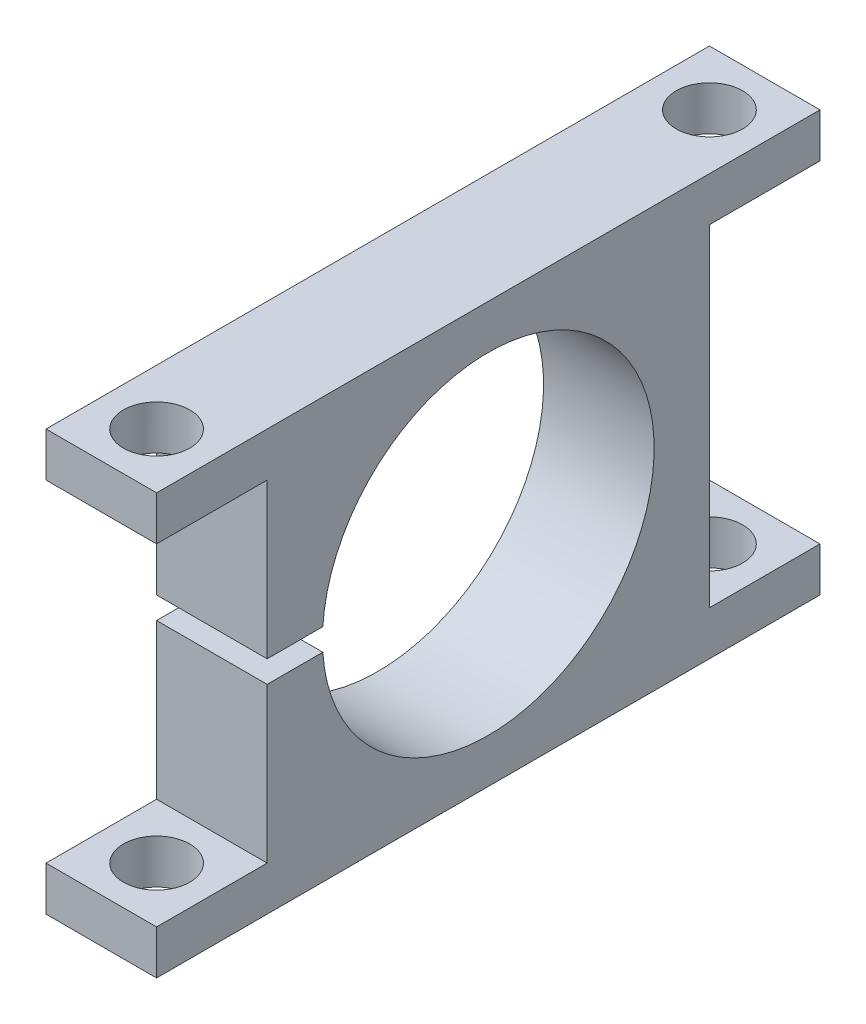
ISO-10303-21;
HEADER;
FILE_DESCRIPTION(('STEP AP214'),'2;1');
FILE_NAME('part.step','',(''),(''),'','','');
FILE_SCHEMA(('AUTOMOTIVE_DESIGN { 1 0 10303 214 1 1 1 1 }'));
ENDSEC;
DATA;
#1=APPLICATION_CONTEXT('core data for automotive mechanical design processes');
#2=APPLICATION_PROTOCOL_DEFINITION('international standard','automotive_design',2000,#1);
#3=PRODUCT_CONTEXT('',#1,'mechanical');
#4=PRODUCT('Part','Part','',(#3));
#5=PRODUCT_RELATED_PRODUCT_CATEGORY('part','',(#4));
#6=PRODUCT_DEFINITION_FORMATION('','',#4);
#7=PRODUCT_DEFINITION_CONTEXT('part definition',#1,'design');
#8=PRODUCT_DEFINITION('design','',#6,#7);
#9=PRODUCT_DEFINITION_SHAPE('','',#8);
#10=(LENGTH_UNIT() NAMED_UNIT(*) SI_UNIT(.MILLI.,.METRE.));
#11=(NAMED_UNIT(*) PLANE_ANGLE_UNIT() SI_UNIT($,.RADIAN.));
#12=(NAMED_UNIT(*) SI_UNIT($,.STERADIAN.) SOLID_ANGLE_UNIT());
#13=UNCERTAINTY_MEASURE_WITH_UNIT(LENGTH_MEASURE(1.E-05),#10,'distance_accuracy_value','');
#14=(GEOMETRIC_REPRESENTATION_CONTEXT(3) GLOBAL_UNCERTAINTY_ASSIGNED_CONTEXT((#13)) GLOBAL_UNIT_ASSIGNED_CONTEXT((#10,
#11,#12)) REPRESENTATION_CONTEXT('',''));
#15=CARTESIAN_POINT('',(0.,0.,0.));
#16=DIRECTION('',(0.,0.,1.));
#17=DIRECTION('',(1.,0.,0.));
#18=AXIS2_PLACEMENT_3D('',#15,#16,#17);
#19=CARTESIAN_POINT('',(5.,-9.5,10.));
#20=DIRECTION('',(0.,0.,-1.));
#21=DIRECTION('',(-1.,0.,0.));
#22=AXIS2_PLACEMENT_3D('',#19,#20,#21);
#23=PLANE('',#22);
#24=DIRECTION('',(0.,-1.,0.));
#25=VECTOR('',#24,1.);
#26=CARTESIAN_POINT('',(0.,-9.5,10.));
#27=LINE('',#26,#25);
#28=CARTESIAN_POINT('',(0.,7.5,10.));
#29=VERTEX_POINT('',#28);
#30=CARTESIAN_POINT('',(0.,0.5,10.));
#31=VERTEX_POINT('',#30);
#32=EDGE_CURVE('E224',#29,#31,#27,.T.);
#33=ORIENTED_EDGE('',*,*,#32,.T.);
#34=DIRECTION('',(1.,0.,0.));
#35=VECTOR('',#34,1.);
#36=CARTESIAN_POINT('',(5.,0.5,10.));
#37=LINE('',#36,#35);
#38=CARTESIAN_POINT('',(5.,0.5,10.));
#39=VERTEX_POINT('',#38);
#40=EDGE_CURVE('E385',#31,#39,#37,.T.);
#41=ORIENTED_EDGE('',*,*,#40,.T.);
#42=DIRECTION('',(0.,-1.,0.));
#43=VECTOR('',#42,1.);
#44=CARTESIAN_POINT('',(5.,-9.5,10.));
#45=LINE('',#44,#43);
#46=CARTESIAN_POINT('',(5.,7.5,10.));
#47=VERTEX_POINT('',#46);
#48=EDGE_CURVE('E203',#47,#39,#45,.T.);
#49=ORIENTED_EDGE('',*,*,#48,.F.);
#50=DIRECTION('',(-1.,0.,0.));
#51=VECTOR('',#50,1.);
#52=CARTESIAN_POINT('',(5.,7.5,10.));
#53=LINE('',#52,#51);
#54=EDGE_CURVE('E262',#47,#29,#53,.T.);
#55=ORIENTED_EDGE('',*,*,#54,.T.);
#56=EDGE_LOOP('',(#33,#41,#49,#55));
#57=FACE_BOUND('',#56,.T.);
#58=ADVANCED_FACE('F35',(#57),#23,.F.);
#59=CARTESIAN_POINT('',(5.,-9.5,-10.));
#60=DIRECTION('',(0.,0.,1.));
#61=DIRECTION('',(1.,0.,0.));
#62=AXIS2_PLACEMENT_3D('',#59,#60,#61);
#63=PLANE('',#62);
#64=DIRECTION('',(0.,1.,0.));
#65=VECTOR('',#64,1.);
#66=CARTESIAN_POINT('',(5.,-9.5,-10.));
#67=LINE('',#66,#65);
#68=CARTESIAN_POINT('',(5.,-7.5,-10.));
#69=VERTEX_POINT('',#68);
#70=CARTESIAN_POINT('',(5.,7.5,-10.));
#71=VERTEX_POINT('',#70);
#72=EDGE_CURVE('E216',#69,#71,#67,.T.);
#73=ORIENTED_EDGE('',*,*,#72,.F.);
#74=DIRECTION('',(-1.,0.,0.));
#75=VECTOR('',#74,1.);
#76=CARTESIAN_POINT('',(5.,-7.5,-10.));
#77=LINE('',#76,#75);
#78=CARTESIAN_POINT('',(0.,-7.5,-10.));
#79=VERTEX_POINT('',#78);
#80=EDGE_CURVE('E347',#69,#79,#77,.T.);
#81=ORIENTED_EDGE('',*,*,#80,.T.);
#82=DIRECTION('',(0.,1.,0.));
#83=VECTOR('',#82,1.);
#84=CARTESIAN_POINT('',(0.,-9.5,-10.));
#85=LINE('',#84,#83);
#86=CARTESIAN_POINT('',(0.,7.5,-10.));
#87=VERTEX_POINT('',#86);
#88=EDGE_CURVE('E230',#79,#87,#85,.T.);
#89=ORIENTED_EDGE('',*,*,#88,.T.);
#90=DIRECTION('',(-1.,0.,0.));
#91=VECTOR('',#90,1.);
#92=CARTESIAN_POINT('',(5.,7.5,-10.));
#93=LINE('',#92,#91);
#94=EDGE_CURVE('E318',#71,#87,#93,.T.);
#95=ORIENTED_EDGE('',*,*,#94,.F.);
#96=EDGE_LOOP('',(#73,#81,#89,#95));
#97=FACE_BOUND('',#96,.T.);
#98=ADVANCED_FACE('F440',(#97),#63,.F.);
#99=CARTESIAN_POINT('',(5.,0.,0.));
#100=DIRECTION('',(1.,0.,0.));
#101=DIRECTION('',(0.,0.,-1.));
#102=AXIS2_PLACEMENT_3D('',#99,#100,#101);
#103=PLANE('',#102);
#104=DIRECTION('',(0.,0.,1.));
#105=VECTOR('',#104,1.);
#106=CARTESIAN_POINT('',(5.,0.5,4.83298002146936));
#107=LINE('',#106,#105);
#108=CARTESIAN_POINT('',(5.,0.5,7.48331477354788));
#109=VERTEX_POINT('',#108);
#110=EDGE_CURVE('E198',#109,#39,#107,.T.);
#111=ORIENTED_EDGE('',*,*,#110,.F.);
#112=CARTESIAN_POINT('',(5.,0.,0.));
#113=DIRECTION('',(1.,0.,0.));
#114=DIRECTION('',(0.,0.,-1.));
#115=AXIS2_PLACEMENT_3D('',#112,#113,#114);
#116=CIRCLE('',#115,7.5);
#117=CARTESIAN_POINT('',(5.,-0.5,7.48331477354788));
#118=VERTEX_POINT('',#117);
#119=EDGE_CURVE('E197',#118,#109,#116,.T.);
#120=ORIENTED_EDGE('',*,*,#119,.F.);
#121=DIRECTION('',(0.,0.,-1.));
#122=VECTOR('',#121,1.);
#123=CARTESIAN_POINT('',(5.,-0.5,4.83298002146936));
#124=LINE('',#123,#122);
#125=CARTESIAN_POINT('',(5.,-0.5,10.));
#126=VERTEX_POINT('',#125);
#127=EDGE_CURVE('E57',#126,#118,#124,.T.);
#128=ORIENTED_EDGE('',*,*,#127,.F.);
#129=CARTESIAN_POINT('',(5.,-7.5,10.));
#130=VERTEX_POINT('',#129);
#131=EDGE_CURVE('E194',#126,#130,#45,.T.);
#132=ORIENTED_EDGE('',*,*,#131,.T.);
#133=DIRECTION('',(0.,0.,-1.));
#134=VECTOR('',#133,1.);
#135=CARTESIAN_POINT('',(5.,-7.5,15.));
#136=LINE('',#135,#134);
#137=CARTESIAN_POINT('',(5.,-7.5,15.));
#138=VERTEX_POINT('',#137);
#139=EDGE_CURVE('E296',#138,#130,#136,.T.);
#140=ORIENTED_EDGE('',*,*,#139,.F.);
#141=DIRECTION('',(0.,1.,0.));
#142=VECTOR('',#141,1.);
#143=CARTESIAN_POINT('',(5.,-9.5,15.));
#144=LINE('',#143,#142);
#145=CARTESIAN_POINT('',(5.,-9.5,15.));
#146=VERTEX_POINT('',#145);
#147=EDGE_CURVE('E303',#146,#138,#144,.T.);
#148=ORIENTED_EDGE('',*,*,#147,.F.);
#149=DIRECTION('',(0.,0.,-1.));
#150=VECTOR('',#149,1.);
#151=CARTESIAN_POINT('',(5.,-9.5,10.));
#152=LINE('',#151,#150);
#153=CARTESIAN_POINT('',(5.,-9.5,-15.));
#154=VERTEX_POINT('',#153);
#155=EDGE_CURVE('E207',#146,#154,#152,.T.);
#156=ORIENTED_EDGE('',*,*,#155,.T.);
#157=DIRECTION('',(0.,-1.,0.));
#158=VECTOR('',#157,1.);
#159=CARTESIAN_POINT('',(5.,-9.5,-15.));
#160=LINE('',#159,#158);
#161=CARTESIAN_POINT('',(5.,-7.5,-15.));
#162=VERTEX_POINT('',#161);
#163=EDGE_CURVE('E355',#162,#154,#160,.T.);
#164=ORIENTED_EDGE('',*,*,#163,.F.);
#165=DIRECTION('',(0.,0.,-1.));
#166=VECTOR('',#165,1.);
#167=CARTESIAN_POINT('',(5.,-7.5,-15.));
#168=LINE('',#167,#166);
#169=EDGE_CURVE('E358',#69,#162,#168,.T.);
#170=ORIENTED_EDGE('',*,*,#169,.F.);
#171=ORIENTED_EDGE('',*,*,#72,.T.);
#172=DIRECTION('',(0.,0.,1.));
#173=VECTOR('',#172,1.);
#174=CARTESIAN_POINT('',(5.,7.5,-15.));
#175=LINE('',#174,#173);
#176=CARTESIAN_POINT('',(5.,7.5,-15.));
#177=VERTEX_POINT('',#176);
#178=EDGE_CURVE('E322',#177,#71,#175,.T.);
#179=ORIENTED_EDGE('',*,*,#178,.F.);
#180=DIRECTION('',(0.,-1.,0.));
#181=VECTOR('',#180,1.);
#182=CARTESIAN_POINT('',(5.,9.5,-15.));
#183=LINE('',#182,#181);
#184=CARTESIAN_POINT('',(5.,9.5,-15.));
#185=VERTEX_POINT('',#184);
#186=EDGE_CURVE('E331',#185,#177,#183,.T.);
#187=ORIENTED_EDGE('',*,*,#186,.F.);
#188=DIRECTION('',(0.,0.,1.));
#189=VECTOR('',#188,1.);
#190=CARTESIAN_POINT('',(5.,9.5,-10.));
#191=LINE('',#190,#189);
#192=CARTESIAN_POINT('',(5.,9.5,15.));
#193=VERTEX_POINT('',#192);
#194=EDGE_CURVE('E218',#185,#193,#191,.T.);
#195=ORIENTED_EDGE('',*,*,#194,.T.);
#196=DIRECTION('',(0.,1.,0.));
#197=VECTOR('',#196,1.);
#198=CARTESIAN_POINT('',(5.,9.5,15.));
#199=LINE('',#198,#197);
#200=CARTESIAN_POINT('',(5.,7.5,15.));
#201=VERTEX_POINT('',#200);
#202=EDGE_CURVE('E258',#201,#193,#199,.T.);
#203=ORIENTED_EDGE('',*,*,#202,.F.);
#204=DIRECTION('',(0.,0.,1.));
#205=VECTOR('',#204,1.);
#206=CARTESIAN_POINT('',(5.,7.5,15.));
#207=LINE('',#206,#205);
#208=EDGE_CURVE('E273',#47,#201,#207,.T.);
#209=ORIENTED_EDGE('',*,*,#208,.F.);
#210=ORIENTED_EDGE('',*,*,#48,.T.);
#211=EDGE_LOOP('',(#111,#120,#128,#132,#140,#148,#156,#164,#170,#171,#179,#187,#195,#203,#209,#210));
#212=FACE_BOUND('',#211,.T.);
#213=ADVANCED_FACE('F192',(#212),#103,.T.);
#214=CARTESIAN_POINT('',(0.,0.,0.));
#215=DIRECTION('',(1.,0.,0.));
#216=DIRECTION('',(0.,0.,-1.));
#217=AXIS2_PLACEMENT_3D('',#214,#215,#216);
#218=PLANE('',#217);
#219=CARTESIAN_POINT('',(0.,0.,0.));
#220=DIRECTION('',(1.,0.,0.));
#221=DIRECTION('',(0.,0.,-1.));
#222=AXIS2_PLACEMENT_3D('',#219,#220,#221);
#223=CIRCLE('',#222,7.5);
#224=CARTESIAN_POINT('',(0.,-0.5,7.48331477354788));
#225=VERTEX_POINT('',#224);
#226=CARTESIAN_POINT('',(0.,0.5,7.48331477354788));
#227=VERTEX_POINT('',#226);
#228=EDGE_CURVE('E213',#225,#227,#223,.T.);
#229=ORIENTED_EDGE('',*,*,#228,.T.);
#230=DIRECTION('',(0.,0.,1.));
#231=VECTOR('',#230,1.);
#232=CARTESIAN_POINT('',(0.,0.500000000000001,0.));
#233=LINE('',#232,#231);
#234=EDGE_CURVE('E49',#227,#31,#233,.T.);
#235=ORIENTED_EDGE('',*,*,#234,.T.);
#236=ORIENTED_EDGE('',*,*,#32,.F.);
#237=CARTESIAN_POINT('',(0.,9.5,10.));
#238=VERTEX_POINT('',#237);
#239=EDGE_CURVE('E220',#238,#29,#27,.T.);
#240=ORIENTED_EDGE('',*,*,#239,.F.);
#241=DIRECTION('',(0.,0.,1.));
#242=VECTOR('',#241,1.);
#243=CARTESIAN_POINT('',(0.,9.5,-10.));
#244=LINE('',#243,#242);
#245=CARTESIAN_POINT('',(0.,9.5,-10.));
#246=VERTEX_POINT('',#245);
#247=EDGE_CURVE('E204',#246,#238,#244,.T.);
#248=ORIENTED_EDGE('',*,*,#247,.F.);
#249=EDGE_CURVE('E228',#87,#246,#85,.T.);
#250=ORIENTED_EDGE('',*,*,#249,.F.);
#251=ORIENTED_EDGE('',*,*,#88,.F.);
#252=CARTESIAN_POINT('',(0.,-9.5,-10.));
#253=VERTEX_POINT('',#252);
#254=EDGE_CURVE('E209',#253,#79,#85,.T.);
#255=ORIENTED_EDGE('',*,*,#254,.F.);
#256=DIRECTION('',(0.,0.,-1.));
#257=VECTOR('',#256,1.);
#258=CARTESIAN_POINT('',(0.,-9.5,10.));
#259=LINE('',#258,#257);
#260=CARTESIAN_POINT('',(0.,-9.5,10.));
#261=VERTEX_POINT('',#260);
#262=EDGE_CURVE('E223',#261,#253,#259,.T.);
#263=ORIENTED_EDGE('',*,*,#262,.F.);
#264=DIRECTION('',(0.,1.,0.));
#265=VECTOR('',#264,1.);
#266=CARTESIAN_POINT('',(0.,0.,10.));
#267=LINE('',#266,#265);
#268=CARTESIAN_POINT('',(0.,-7.5,10.));
#269=VERTEX_POINT('',#268);
#270=EDGE_CURVE('E291',#261,#269,#267,.T.);
#271=ORIENTED_EDGE('',*,*,#270,.T.);
#272=CARTESIAN_POINT('',(0.,-0.5,10.));
#273=VERTEX_POINT('',#272);
#274=EDGE_CURVE('E225',#273,#269,#27,.T.);
#275=ORIENTED_EDGE('',*,*,#274,.F.);
#276=DIRECTION('',(0.,0.,-1.));
#277=VECTOR('',#276,1.);
#278=CARTESIAN_POINT('',(0.,-0.499999999999999,0.));
#279=LINE('',#278,#277);
#280=EDGE_CURVE('E184',#273,#225,#279,.T.);
#281=ORIENTED_EDGE('',*,*,#280,.T.);
#282=EDGE_LOOP('',(#229,#235,#236,#240,#248,#250,#251,#255,#263,#271,#275,#281));
#283=FACE_BOUND('',#282,.T.);
#284=ADVANCED_FACE('F245',(#283),#218,.F.);
#285=ORIENTED_EDGE('',*,*,#131,.F.);
#286=DIRECTION('',(-1.,0.,0.));
#287=VECTOR('',#286,1.);
#288=CARTESIAN_POINT('',(5.,-0.5,10.));
#289=LINE('',#288,#287);
#290=EDGE_CURVE('E181',#126,#273,#289,.T.);
#291=ORIENTED_EDGE('',*,*,#290,.T.);
#292=ORIENTED_EDGE('',*,*,#274,.T.);
#293=DIRECTION('',(-1.,0.,0.));
#294=VECTOR('',#293,1.);
#295=CARTESIAN_POINT('',(5.,-7.5,10.));
#296=LINE('',#295,#294);
#297=EDGE_CURVE('E202',#130,#269,#296,.T.);
#298=ORIENTED_EDGE('',*,*,#297,.F.);
#299=EDGE_LOOP('',(#285,#291,#292,#298));
#300=FACE_BOUND('',#299,.T.);
#301=ADVANCED_FACE('F37',(#300),#23,.F.);
#302=CARTESIAN_POINT('',(5.,-9.5,10.));
#303=DIRECTION('',(0.,1.,0.));
#304=DIRECTION('',(0.,0.,1.));
#305=AXIS2_PLACEMENT_3D('',#302,#303,#304);
#306=PLANE('',#305);
#307=CARTESIAN_POINT('',(2.49995,-9.50000000000001,-12.5));
#308=DIRECTION('',(0.,1.,0.));
#309=DIRECTION('',(0.,0.,1.));
#310=AXIS2_PLACEMENT_3D('',#307,#308,#309);
#311=CIRCLE('',#310,1.5);
#312=CARTESIAN_POINT('',(2.49995,-9.50000000000001,-11.));
#313=VERTEX_POINT('',#312);
#314=EDGE_CURVE('E240',#313,#313,#311,.T.);
#315=ORIENTED_EDGE('',*,*,#314,.T.);
#316=EDGE_LOOP('',(#315));
#317=FACE_BOUND('',#316,.T.);
#318=CARTESIAN_POINT('',(2.49995,-9.50000000000001,12.5));
#319=DIRECTION('',(0.,1.,0.));
#320=DIRECTION('',(0.,0.,1.));
#321=AXIS2_PLACEMENT_3D('',#318,#319,#320);
#322=CIRCLE('',#321,1.5);
#323=CARTESIAN_POINT('',(2.49995,-9.50000000000001,14.));
#324=VERTEX_POINT('',#323);
#325=EDGE_CURVE('E236',#324,#324,#322,.T.);
#326=ORIENTED_EDGE('',*,*,#325,.T.);
#327=EDGE_LOOP('',(#326));
#328=FACE_BOUND('',#327,.T.);
#329=ORIENTED_EDGE('',*,*,#262,.T.);
#330=DIRECTION('',(-1.,0.,0.));
#331=VECTOR('',#330,1.);
#332=CARTESIAN_POINT('',(5.,-9.5,-10.));
#333=LINE('',#332,#331);
#334=CARTESIAN_POINT('',(-0.0001,-9.5,-10.));
#335=VERTEX_POINT('',#334);
#336=EDGE_CURVE('E346',#253,#335,#333,.T.);
#337=ORIENTED_EDGE('',*,*,#336,.T.);
#338=DIRECTION('',(0.,0.,1.));
#339=VECTOR('',#338,1.);
#340=CARTESIAN_POINT('',(-0.0001,-9.5,-10.));
#341=LINE('',#340,#339);
#342=CARTESIAN_POINT('',(-0.0001,-9.5,-15.));
#343=VERTEX_POINT('',#342);
#344=EDGE_CURVE('E361',#343,#335,#341,.T.);
#345=ORIENTED_EDGE('',*,*,#344,.F.);
#346=DIRECTION('',(-1.,0.,0.));
#347=VECTOR('',#346,1.);
#348=CARTESIAN_POINT('',(5.,-9.5,-15.));
#349=LINE('',#348,#347);
#350=EDGE_CURVE('E352',#154,#343,#349,.T.);
#351=ORIENTED_EDGE('',*,*,#350,.F.);
#352=ORIENTED_EDGE('',*,*,#155,.F.);
#353=DIRECTION('',(-1.,0.,0.));
#354=VECTOR('',#353,1.);
#355=CARTESIAN_POINT('',(5.,-9.5,15.));
#356=LINE('',#355,#354);
#357=CARTESIAN_POINT('',(-0.0001,-9.5,15.));
#358=VERTEX_POINT('',#357);
#359=EDGE_CURVE('E295',#146,#358,#356,.T.);
#360=ORIENTED_EDGE('',*,*,#359,.T.);
#361=DIRECTION('',(0.,0.,1.));
#362=VECTOR('',#361,1.);
#363=CARTESIAN_POINT('',(-0.0001,-9.5,10.));
#364=LINE('',#363,#362);
#365=CARTESIAN_POINT('',(-0.0001,-9.5,10.));
#366=VERTEX_POINT('',#365);
#367=EDGE_CURVE('E312',#366,#358,#364,.T.);
#368=ORIENTED_EDGE('',*,*,#367,.F.);
#369=DIRECTION('',(-1.,0.,0.));
#370=VECTOR('',#369,1.);
#371=CARTESIAN_POINT('',(5.,-9.5,10.));
#372=LINE('',#371,#370);
#373=EDGE_CURVE('E293',#261,#366,#372,.T.);
#374=ORIENTED_EDGE('',*,*,#373,.F.);
#375=EDGE_LOOP('',(#329,#337,#345,#351,#352,#360,#368,#374));
#376=FACE_BOUND('',#375,.T.);
#377=ADVANCED_FACE('F418',(#317,#328,#376),#306,.F.);
#378=CARTESIAN_POINT('',(5.,9.5,-10.));
#379=DIRECTION('',(0.,-1.,0.));
#380=DIRECTION('',(0.,0.,-1.));
#381=AXIS2_PLACEMENT_3D('',#378,#379,#380);
#382=PLANE('',#381);
#383=CARTESIAN_POINT('',(2.49995,9.5,-12.5));
#384=DIRECTION('',(0.,1.,0.));
#385=DIRECTION('',(0.,0.,1.));
#386=AXIS2_PLACEMENT_3D('',#383,#384,#385);
#387=CIRCLE('',#386,1.5);
#388=CARTESIAN_POINT('',(2.49995,9.5,-11.));
#389=VERTEX_POINT('',#388);
#390=EDGE_CURVE('E382',#389,#389,#387,.T.);
#391=ORIENTED_EDGE('',*,*,#390,.F.);
#392=EDGE_LOOP('',(#391));
#393=FACE_BOUND('',#392,.T.);
#394=CARTESIAN_POINT('',(2.49995,9.5,12.5));
#395=DIRECTION('',(0.,1.,0.));
#396=DIRECTION('',(0.,0.,1.));
#397=AXIS2_PLACEMENT_3D('',#394,#395,#396);
#398=CIRCLE('',#397,1.5);
#399=CARTESIAN_POINT('',(2.49995,9.5,14.));
#400=VERTEX_POINT('',#399);
#401=EDGE_CURVE('E375',#400,#400,#398,.T.);
#402=ORIENTED_EDGE('',*,*,#401,.F.);
#403=EDGE_LOOP('',(#402));
#404=FACE_BOUND('',#403,.T.);
#405=ORIENTED_EDGE('',*,*,#247,.T.);
#406=DIRECTION('',(-1.,0.,0.));
#407=VECTOR('',#406,1.);
#408=CARTESIAN_POINT('',(5.,9.5,10.));
#409=LINE('',#408,#407);
#410=CARTESIAN_POINT('',(-0.0001,9.5,10.));
#411=VERTEX_POINT('',#410);
#412=EDGE_CURVE('E249',#238,#411,#409,.T.);
#413=ORIENTED_EDGE('',*,*,#412,.T.);
#414=DIRECTION('',(0.,0.,-1.));
#415=VECTOR('',#414,1.);
#416=CARTESIAN_POINT('',(-0.0001,9.5,10.));
#417=LINE('',#416,#415);
#418=CARTESIAN_POINT('',(-0.0001,9.5,15.));
#419=VERTEX_POINT('',#418);
#420=EDGE_CURVE('E277',#419,#411,#417,.T.);
#421=ORIENTED_EDGE('',*,*,#420,.F.);
#422=DIRECTION('',(-1.,0.,0.));
#423=VECTOR('',#422,1.);
#424=CARTESIAN_POINT('',(5.,9.5,15.));
#425=LINE('',#424,#423);
#426=EDGE_CURVE('E250',#193,#419,#425,.T.);
#427=ORIENTED_EDGE('',*,*,#426,.F.);
#428=ORIENTED_EDGE('',*,*,#194,.F.);
#429=DIRECTION('',(-1.,0.,0.));
#430=VECTOR('',#429,1.);
#431=CARTESIAN_POINT('',(5.,9.5,-15.));
#432=LINE('',#431,#430);
#433=CARTESIAN_POINT('',(-0.0001,9.5,-15.));
#434=VERTEX_POINT('',#433);
#435=EDGE_CURVE('E321',#185,#434,#432,.T.);
#436=ORIENTED_EDGE('',*,*,#435,.T.);
#437=DIRECTION('',(0.,0.,-1.));
#438=VECTOR('',#437,1.);
#439=CARTESIAN_POINT('',(-0.0001,9.5,-10.));
#440=LINE('',#439,#438);
#441=CARTESIAN_POINT('',(-0.0001,9.5,-10.));
#442=VERTEX_POINT('',#441);
#443=EDGE_CURVE('E340',#442,#434,#440,.T.);
#444=ORIENTED_EDGE('',*,*,#443,.F.);
#445=DIRECTION('',(-1.,0.,0.));
#446=VECTOR('',#445,1.);
#447=CARTESIAN_POINT('',(5.,9.5,-10.));
#448=LINE('',#447,#446);
#449=EDGE_CURVE('E319',#246,#442,#448,.T.);
#450=ORIENTED_EDGE('',*,*,#449,.F.);
#451=EDGE_LOOP('',(#405,#413,#421,#427,#428,#436,#444,#450));
#452=FACE_BOUND('',#451,.T.);
#453=ADVANCED_FACE('F396',(#393,#404,#452),#382,.F.);
#454=CARTESIAN_POINT('',(5.,0.,0.));
#455=DIRECTION('',(-1.,0.,0.));
#456=DIRECTION('',(0.,0.,1.));
#457=AXIS2_PLACEMENT_3D('',#454,#455,#456);
#458=CYLINDRICAL_SURFACE('',#457,7.5);
#459=DIRECTION('',(-1.,0.,0.));
#460=VECTOR('',#459,1.);
#461=CARTESIAN_POINT('',(5.,0.5,7.48331477354788));
#462=LINE('',#461,#460);
#463=EDGE_CURVE('E11',#227,#109,#462,.F.);
#464=ORIENTED_EDGE('',*,*,#463,.F.);
#465=ORIENTED_EDGE('',*,*,#228,.F.);
#466=DIRECTION('',(-1.,0.,0.));
#467=VECTOR('',#466,1.);
#468=CARTESIAN_POINT('',(5.,-0.5,7.48331477354788));
#469=LINE('',#468,#467);
#470=EDGE_CURVE('E43',#118,#225,#469,.T.);
#471=ORIENTED_EDGE('',*,*,#470,.F.);
#472=ORIENTED_EDGE('',*,*,#119,.T.);
#473=EDGE_LOOP('',(#464,#465,#471,#472));
#474=FACE_BOUND('',#473,.T.);
#475=ADVANCED_FACE('F248',(#474),#458,.F.);
#476=CARTESIAN_POINT('',(5.,7.5,10.));
#477=DIRECTION('',(0.,0.,-1.));
#478=DIRECTION('',(-1.,0.,0.));
#479=AXIS2_PLACEMENT_3D('',#476,#477,#478);
#480=PLANE('',#479);
#481=ORIENTED_EDGE('',*,*,#412,.F.);
#482=ORIENTED_EDGE('',*,*,#239,.T.);
#483=CARTESIAN_POINT('',(-0.0001,7.5,10.));
#484=VERTEX_POINT('',#483);
#485=EDGE_CURVE('E264',#29,#484,#53,.T.);
#486=ORIENTED_EDGE('',*,*,#485,.T.);
#487=DIRECTION('',(0.,-1.,0.));
#488=VECTOR('',#487,1.);
#489=CARTESIAN_POINT('',(-0.0001,7.5,10.));
#490=LINE('',#489,#488);
#491=EDGE_CURVE('E288',#411,#484,#490,.T.);
#492=ORIENTED_EDGE('',*,*,#491,.F.);
#493=EDGE_LOOP('',(#481,#482,#486,#492));
#494=FACE_BOUND('',#493,.T.);
#495=ADVANCED_FACE('F403',(#494),#480,.T.);
#496=CARTESIAN_POINT('',(5.,9.5,15.));
#497=DIRECTION('',(0.,0.,1.));
#498=DIRECTION('',(1.,0.,0.));
#499=AXIS2_PLACEMENT_3D('',#496,#497,#498);
#500=PLANE('',#499);
#501=ORIENTED_EDGE('',*,*,#426,.T.);
#502=DIRECTION('',(0.,1.,0.));
#503=VECTOR('',#502,1.);
#504=CARTESIAN_POINT('',(-0.0001,9.5,15.));
#505=LINE('',#504,#503);
#506=CARTESIAN_POINT('',(-0.0001,7.5,15.));
#507=VERTEX_POINT('',#506);
#508=EDGE_CURVE('E280',#507,#419,#505,.T.);
#509=ORIENTED_EDGE('',*,*,#508,.F.);
#510=DIRECTION('',(-1.,0.,0.));
#511=VECTOR('',#510,1.);
#512=CARTESIAN_POINT('',(5.,7.5,15.));
#513=LINE('',#512,#511);
#514=EDGE_CURVE('E255',#201,#507,#513,.T.);
#515=ORIENTED_EDGE('',*,*,#514,.F.);
#516=ORIENTED_EDGE('',*,*,#202,.T.);
#517=EDGE_LOOP('',(#501,#509,#515,#516));
#518=FACE_BOUND('',#517,.T.);
#519=ADVANCED_FACE('F398',(#518),#500,.T.);
#520=CARTESIAN_POINT('',(5.,7.5,15.));
#521=DIRECTION('',(0.,-1.,0.));
#522=DIRECTION('',(0.,0.,-1.));
#523=AXIS2_PLACEMENT_3D('',#520,#521,#522);
#524=PLANE('',#523);
#525=CARTESIAN_POINT('',(2.49995,7.5,12.5));
#526=DIRECTION('',(0.,-1.,0.));
#527=DIRECTION('',(0.,0.,-1.));
#528=AXIS2_PLACEMENT_3D('',#525,#526,#527);
#529=CIRCLE('',#528,1.5);
#530=CARTESIAN_POINT('',(2.49995,7.5,11.));
#531=VERTEX_POINT('',#530);
#532=EDGE_CURVE('E235',#531,#531,#529,.T.);
#533=ORIENTED_EDGE('',*,*,#532,.F.);
#534=EDGE_LOOP('',(#533));
#535=FACE_BOUND('',#534,.T.);
#536=ORIENTED_EDGE('',*,*,#514,.T.);
#537=DIRECTION('',(0.,0.,1.));
#538=VECTOR('',#537,1.);
#539=CARTESIAN_POINT('',(-0.0001,7.5,15.));
#540=LINE('',#539,#538);
#541=EDGE_CURVE('E285',#484,#507,#540,.T.);
#542=ORIENTED_EDGE('',*,*,#541,.F.);
#543=ORIENTED_EDGE('',*,*,#485,.F.);
#544=ORIENTED_EDGE('',*,*,#54,.F.);
#545=ORIENTED_EDGE('',*,*,#208,.T.);
#546=EDGE_LOOP('',(#536,#542,#543,#544,#545));
#547=FACE_BOUND('',#546,.T.);
#548=ADVANCED_FACE('F401',(#535,#547),#524,.T.);
#549=CARTESIAN_POINT('',(-0.0001,0.,0.));
#550=DIRECTION('',(1.,0.,0.));
#551=DIRECTION('',(0.,0.,-1.));
#552=AXIS2_PLACEMENT_3D('',#549,#550,#551);
#553=PLANE('',#552);
#554=ORIENTED_EDGE('',*,*,#491,.T.);
#555=ORIENTED_EDGE('',*,*,#541,.T.);
#556=ORIENTED_EDGE('',*,*,#508,.T.);
#557=ORIENTED_EDGE('',*,*,#420,.T.);
#558=EDGE_LOOP('',(#554,#555,#556,#557));
#559=FACE_BOUND('',#558,.T.);
#560=ADVANCED_FACE('F400',(#559),#553,.F.);
#561=CARTESIAN_POINT('',(5.,-7.5,10.));
#562=DIRECTION('',(0.,0.,-1.));
#563=DIRECTION('',(-1.,0.,0.));
#564=AXIS2_PLACEMENT_3D('',#561,#562,#563);
#565=PLANE('',#564);
#566=ORIENTED_EDGE('',*,*,#270,.F.);
#567=ORIENTED_EDGE('',*,*,#373,.T.);
#568=DIRECTION('',(0.,-1.,0.));
#569=VECTOR('',#568,1.);
#570=CARTESIAN_POINT('',(-0.0001,-7.5,10.));
#571=LINE('',#570,#569);
#572=CARTESIAN_POINT('',(-0.0001,-7.5,10.));
#573=VERTEX_POINT('',#572);
#574=EDGE_CURVE('E315',#573,#366,#571,.T.);
#575=ORIENTED_EDGE('',*,*,#574,.F.);
#576=EDGE_CURVE('E300',#269,#573,#296,.T.);
#577=ORIENTED_EDGE('',*,*,#576,.F.);
#578=EDGE_LOOP('',(#566,#567,#575,#577));
#579=FACE_BOUND('',#578,.T.);
#580=ADVANCED_FACE('F410',(#579),#565,.T.);
#581=CARTESIAN_POINT('',(5.,-7.5,15.));
#582=DIRECTION('',(0.,1.,0.));
#583=DIRECTION('',(0.,0.,1.));
#584=AXIS2_PLACEMENT_3D('',#581,#582,#583);
#585=PLANE('',#584);
#586=CARTESIAN_POINT('',(2.49995,-7.5,12.5));
#587=DIRECTION('',(0.,1.,0.));
#588=DIRECTION('',(0.,0.,1.));
#589=AXIS2_PLACEMENT_3D('',#586,#587,#588);
#590=CIRCLE('',#589,1.5);
#591=CARTESIAN_POINT('',(2.49995,-7.5,14.));
#592=VERTEX_POINT('',#591);
#593=EDGE_CURVE('E232',#592,#592,#590,.T.);
#594=ORIENTED_EDGE('',*,*,#593,.F.);
#595=EDGE_LOOP('',(#594));
#596=FACE_BOUND('',#595,.T.);
#597=ORIENTED_EDGE('',*,*,#297,.T.);
#598=ORIENTED_EDGE('',*,*,#576,.T.);
#599=DIRECTION('',(0.,0.,-1.));
#600=VECTOR('',#599,1.);
#601=CARTESIAN_POINT('',(-0.0001,-7.5,15.));
#602=LINE('',#601,#600);
#603=CARTESIAN_POINT('',(-0.0001,-7.5,15.));
#604=VERTEX_POINT('',#603);
#605=EDGE_CURVE('E306',#604,#573,#602,.T.);
#606=ORIENTED_EDGE('',*,*,#605,.F.);
#607=DIRECTION('',(-1.,0.,0.));
#608=VECTOR('',#607,1.);
#609=CARTESIAN_POINT('',(5.,-7.5,15.));
#610=LINE('',#609,#608);
#611=EDGE_CURVE('E298',#138,#604,#610,.T.);
#612=ORIENTED_EDGE('',*,*,#611,.F.);
#613=ORIENTED_EDGE('',*,*,#139,.T.);
#614=EDGE_LOOP('',(#597,#598,#606,#612,#613));
#615=FACE_BOUND('',#614,.T.);
#616=ADVANCED_FACE('F414',(#596,#615),#585,.T.);
#617=CARTESIAN_POINT('',(5.,-9.5,15.));
#618=DIRECTION('',(0.,0.,1.));
#619=DIRECTION('',(1.,0.,0.));
#620=AXIS2_PLACEMENT_3D('',#617,#618,#619);
#621=PLANE('',#620);
#622=ORIENTED_EDGE('',*,*,#611,.T.);
#623=DIRECTION('',(0.,1.,0.));
#624=VECTOR('',#623,1.);
#625=CARTESIAN_POINT('',(-0.0001,-9.5,15.));
#626=LINE('',#625,#624);
#627=EDGE_CURVE('E309',#358,#604,#626,.T.);
#628=ORIENTED_EDGE('',*,*,#627,.F.);
#629=ORIENTED_EDGE('',*,*,#359,.F.);
#630=ORIENTED_EDGE('',*,*,#147,.T.);
#631=EDGE_LOOP('',(#622,#628,#629,#630));
#632=FACE_BOUND('',#631,.T.);
#633=ADVANCED_FACE('F582',(#632),#621,.T.);
#634=CARTESIAN_POINT('',(-0.0001,0.,0.));
#635=DIRECTION('',(-1.,0.,0.));
#636=DIRECTION('',(0.,0.,1.));
#637=AXIS2_PLACEMENT_3D('',#634,#635,#636);
#638=PLANE('',#637);
#639=ORIENTED_EDGE('',*,*,#574,.T.);
#640=ORIENTED_EDGE('',*,*,#367,.T.);
#641=ORIENTED_EDGE('',*,*,#627,.T.);
#642=ORIENTED_EDGE('',*,*,#605,.T.);
#643=EDGE_LOOP('',(#639,#640,#641,#642));
#644=FACE_BOUND('',#643,.T.);
#645=ADVANCED_FACE('F577',(#644),#638,.T.);
#646=CARTESIAN_POINT('',(5.,7.5,-10.));
#647=DIRECTION('',(0.,0.,1.));
#648=DIRECTION('',(1.,0.,0.));
#649=AXIS2_PLACEMENT_3D('',#646,#647,#648);
#650=PLANE('',#649);
#651=CARTESIAN_POINT('',(-0.0001,7.5,-10.));
#652=VERTEX_POINT('',#651);
#653=EDGE_CURVE('E326',#87,#652,#93,.T.);
#654=ORIENTED_EDGE('',*,*,#653,.F.);
#655=ORIENTED_EDGE('',*,*,#249,.T.);
#656=ORIENTED_EDGE('',*,*,#449,.T.);
#657=DIRECTION('',(0.,1.,0.));
#658=VECTOR('',#657,1.);
#659=CARTESIAN_POINT('',(-0.0001,7.5,-10.));
#660=LINE('',#659,#658);
#661=EDGE_CURVE('E343',#652,#442,#660,.T.);
#662=ORIENTED_EDGE('',*,*,#661,.F.);
#663=EDGE_LOOP('',(#654,#655,#656,#662));
#664=FACE_BOUND('',#663,.T.);
#665=ADVANCED_FACE('F445',(#664),#650,.T.);
#666=CARTESIAN_POINT('',(5.,7.5,-15.));
#667=DIRECTION('',(0.,-1.,0.));
#668=DIRECTION('',(0.,0.,-1.));
#669=AXIS2_PLACEMENT_3D('',#666,#667,#668);
#670=PLANE('',#669);
#671=CARTESIAN_POINT('',(2.49995,7.5,-12.5));
#672=DIRECTION('',(0.,-1.,0.));
#673=DIRECTION('',(0.,0.,-1.));
#674=AXIS2_PLACEMENT_3D('',#671,#672,#673);
#675=CIRCLE('',#674,1.5);
#676=CARTESIAN_POINT('',(2.49995,7.5,-14.));
#677=VERTEX_POINT('',#676);
#678=EDGE_CURVE('E239',#677,#677,#675,.T.);
#679=ORIENTED_EDGE('',*,*,#678,.F.);
#680=EDGE_LOOP('',(#679));
#681=FACE_BOUND('',#680,.T.);
#682=ORIENTED_EDGE('',*,*,#94,.T.);
#683=ORIENTED_EDGE('',*,*,#653,.T.);
#684=DIRECTION('',(0.,0.,1.));
#685=VECTOR('',#684,1.);
#686=CARTESIAN_POINT('',(-0.0001,7.5,-15.));
#687=LINE('',#686,#685);
#688=CARTESIAN_POINT('',(-0.0001,7.5,-15.));
#689=VERTEX_POINT('',#688);
#690=EDGE_CURVE('E334',#689,#652,#687,.T.);
#691=ORIENTED_EDGE('',*,*,#690,.F.);
#692=DIRECTION('',(-1.,0.,0.));
#693=VECTOR('',#692,1.);
#694=CARTESIAN_POINT('',(5.,7.5,-15.));
#695=LINE('',#694,#693);
#696=EDGE_CURVE('E324',#177,#689,#695,.T.);
#697=ORIENTED_EDGE('',*,*,#696,.F.);
#698=ORIENTED_EDGE('',*,*,#178,.T.);
#699=EDGE_LOOP('',(#682,#683,#691,#697,#698));
#700=FACE_BOUND('',#699,.T.);
#701=ADVANCED_FACE('F453',(#681,#700),#670,.T.);
#702=CARTESIAN_POINT('',(5.,9.5,-15.));
#703=DIRECTION('',(0.,0.,-1.));
#704=DIRECTION('',(-1.,0.,0.));
#705=AXIS2_PLACEMENT_3D('',#702,#703,#704);
#706=PLANE('',#705);
#707=ORIENTED_EDGE('',*,*,#696,.T.);
#708=DIRECTION('',(0.,-1.,0.));
#709=VECTOR('',#708,1.);
#710=CARTESIAN_POINT('',(-0.0001,9.5,-15.));
#711=LINE('',#710,#709);
#712=EDGE_CURVE('E337',#434,#689,#711,.T.);
#713=ORIENTED_EDGE('',*,*,#712,.F.);
#714=ORIENTED_EDGE('',*,*,#435,.F.);
#715=ORIENTED_EDGE('',*,*,#186,.T.);
#716=EDGE_LOOP('',(#707,#713,#714,#715));
#717=FACE_BOUND('',#716,.T.);
#718=ADVANCED_FACE('F455',(#717),#706,.T.);
#719=CARTESIAN_POINT('',(-0.0001,0.,0.));
#720=DIRECTION('',(-1.,0.,0.));
#721=DIRECTION('',(0.,0.,1.));
#722=AXIS2_PLACEMENT_3D('',#719,#720,#721);
#723=PLANE('',#722);
#724=ORIENTED_EDGE('',*,*,#661,.T.);
#725=ORIENTED_EDGE('',*,*,#443,.T.);
#726=ORIENTED_EDGE('',*,*,#712,.T.);
#727=ORIENTED_EDGE('',*,*,#690,.T.);
#728=EDGE_LOOP('',(#724,#725,#726,#727));
#729=FACE_BOUND('',#728,.T.);
#730=ADVANCED_FACE('F450',(#729),#723,.T.);
#731=CARTESIAN_POINT('',(5.,-7.5,-10.));
#732=DIRECTION('',(0.,0.,1.));
#733=DIRECTION('',(1.,0.,0.));
#734=AXIS2_PLACEMENT_3D('',#731,#732,#733);
#735=PLANE('',#734);
#736=ORIENTED_EDGE('',*,*,#254,.T.);
#737=CARTESIAN_POINT('',(-0.0001,-7.5,-10.));
#738=VERTEX_POINT('',#737);
#739=EDGE_CURVE('E350',#79,#738,#77,.T.);
#740=ORIENTED_EDGE('',*,*,#739,.T.);
#741=DIRECTION('',(0.,1.,0.));
#742=VECTOR('',#741,1.);
#743=CARTESIAN_POINT('',(-0.0001,-7.5,-10.));
#744=LINE('',#743,#742);
#745=EDGE_CURVE('E370',#335,#738,#744,.T.);
#746=ORIENTED_EDGE('',*,*,#745,.F.);
#747=ORIENTED_EDGE('',*,*,#336,.F.);
#748=EDGE_LOOP('',(#736,#740,#746,#747));
#749=FACE_BOUND('',#748,.T.);
#750=ADVANCED_FACE('F423',(#749),#735,.T.);
#751=CARTESIAN_POINT('',(5.,-9.5,-15.));
#752=DIRECTION('',(0.,0.,-1.));
#753=DIRECTION('',(-1.,0.,0.));
#754=AXIS2_PLACEMENT_3D('',#751,#752,#753);
#755=PLANE('',#754);
#756=ORIENTED_EDGE('',*,*,#350,.T.);
#757=DIRECTION('',(0.,-1.,0.));
#758=VECTOR('',#757,1.);
#759=CARTESIAN_POINT('',(-0.0001,-9.5,-15.));
#760=LINE('',#759,#758);
#761=CARTESIAN_POINT('',(-0.0001,-7.5,-15.));
#762=VERTEX_POINT('',#761);
#763=EDGE_CURVE('E364',#762,#343,#760,.T.);
#764=ORIENTED_EDGE('',*,*,#763,.F.);
#765=DIRECTION('',(-1.,0.,0.));
#766=VECTOR('',#765,1.);
#767=CARTESIAN_POINT('',(5.,-7.5,-15.));
#768=LINE('',#767,#766);
#769=EDGE_CURVE('E349',#162,#762,#768,.T.);
#770=ORIENTED_EDGE('',*,*,#769,.F.);
#771=ORIENTED_EDGE('',*,*,#163,.T.);
#772=EDGE_LOOP('',(#756,#764,#770,#771));
#773=FACE_BOUND('',#772,.T.);
#774=ADVANCED_FACE('F433',(#773),#755,.T.);
#775=CARTESIAN_POINT('',(5.,-7.5,-15.));
#776=DIRECTION('',(0.,1.,0.));
#777=DIRECTION('',(0.,0.,1.));
#778=AXIS2_PLACEMENT_3D('',#775,#776,#777);
#779=PLANE('',#778);
#780=CARTESIAN_POINT('',(2.49995,-7.5,-12.5));
#781=DIRECTION('',(0.,1.,0.));
#782=DIRECTION('',(0.,0.,1.));
#783=AXIS2_PLACEMENT_3D('',#780,#781,#782);
#784=CIRCLE('',#783,1.5);
#785=CARTESIAN_POINT('',(2.49995,-7.5,-11.));
#786=VERTEX_POINT('',#785);
#787=EDGE_CURVE('E237',#786,#786,#784,.T.);
#788=ORIENTED_EDGE('',*,*,#787,.F.);
#789=EDGE_LOOP('',(#788));
#790=FACE_BOUND('',#789,.T.);
#791=ORIENTED_EDGE('',*,*,#769,.T.);
#792=DIRECTION('',(0.,0.,-1.));
#793=VECTOR('',#792,1.);
#794=CARTESIAN_POINT('',(-0.0001,-7.5,-15.));
#795=LINE('',#794,#793);
#796=EDGE_CURVE('E367',#738,#762,#795,.T.);
#797=ORIENTED_EDGE('',*,*,#796,.F.);
#798=ORIENTED_EDGE('',*,*,#739,.F.);
#799=ORIENTED_EDGE('',*,*,#80,.F.);
#800=ORIENTED_EDGE('',*,*,#169,.T.);
#801=EDGE_LOOP('',(#791,#797,#798,#799,#800));
#802=FACE_BOUND('',#801,.T.);
#803=ADVANCED_FACE('F438',(#790,#802),#779,.T.);
#804=CARTESIAN_POINT('',(-0.0001,0.,0.));
#805=DIRECTION('',(1.,0.,0.));
#806=DIRECTION('',(0.,0.,-1.));
#807=AXIS2_PLACEMENT_3D('',#804,#805,#806);
#808=PLANE('',#807);
#809=ORIENTED_EDGE('',*,*,#745,.T.);
#810=ORIENTED_EDGE('',*,*,#796,.T.);
#811=ORIENTED_EDGE('',*,*,#763,.T.);
#812=ORIENTED_EDGE('',*,*,#344,.T.);
#813=EDGE_LOOP('',(#809,#810,#811,#812));
#814=FACE_BOUND('',#813,.T.);
#815=ADVANCED_FACE('F427',(#814),#808,.F.);
#816=CARTESIAN_POINT('',(2.49995,-9.50000000000001,12.5));
#817=DIRECTION('',(0.,1.,0.));
#818=DIRECTION('',(0.,0.,1.));
#819=AXIS2_PLACEMENT_3D('',#816,#817,#818);
#820=CYLINDRICAL_SURFACE('',#819,1.5);
#821=ORIENTED_EDGE('',*,*,#593,.T.);
#822=EDGE_LOOP('',(#821));
#823=FACE_BOUND('',#822,.T.);
#824=ORIENTED_EDGE('',*,*,#325,.F.);
#825=EDGE_LOOP('',(#824));
#826=FACE_BOUND('',#825,.T.);
#827=ADVANCED_FACE('F496',(#823,#826),#820,.F.);
#828=ORIENTED_EDGE('',*,*,#532,.T.);
#829=EDGE_LOOP('',(#828));
#830=FACE_BOUND('',#829,.T.);
#831=ORIENTED_EDGE('',*,*,#401,.T.);
#832=EDGE_LOOP('',(#831));
#833=FACE_BOUND('',#832,.T.);
#834=ADVANCED_FACE('F493',(#830,#833),#820,.F.);
#835=CARTESIAN_POINT('',(2.49995,-9.50000000000001,-12.5));
#836=DIRECTION('',(0.,1.,0.));
#837=DIRECTION('',(0.,0.,1.));
#838=AXIS2_PLACEMENT_3D('',#835,#836,#837);
#839=CYLINDRICAL_SURFACE('',#838,1.5);
#840=ORIENTED_EDGE('',*,*,#787,.T.);
#841=EDGE_LOOP('',(#840));
#842=FACE_BOUND('',#841,.T.);
#843=ORIENTED_EDGE('',*,*,#314,.F.);
#844=EDGE_LOOP('',(#843));
#845=FACE_BOUND('',#844,.T.);
#846=ADVANCED_FACE('F495',(#842,#845),#839,.F.);
#847=ORIENTED_EDGE('',*,*,#678,.T.);
#848=EDGE_LOOP('',(#847));
#849=FACE_BOUND('',#848,.T.);
#850=ORIENTED_EDGE('',*,*,#390,.T.);
#851=EDGE_LOOP('',(#850));
#852=FACE_BOUND('',#851,.T.);
#853=ADVANCED_FACE('F503',(#849,#852),#839,.F.);
#854=CARTESIAN_POINT('',(-0.000100000000000273,-0.5,4.83298002146936));
#855=DIRECTION('',(0.,-1.,0.));
#856=DIRECTION('',(0.,0.,-1.));
#857=AXIS2_PLACEMENT_3D('',#854,#855,#856);
#858=PLANE('',#857);
#859=ORIENTED_EDGE('',*,*,#127,.T.);
#860=ORIENTED_EDGE('',*,*,#470,.T.);
#861=ORIENTED_EDGE('',*,*,#280,.F.);
#862=ORIENTED_EDGE('',*,*,#290,.F.);
#863=EDGE_LOOP('',(#859,#860,#861,#862));
#864=FACE_BOUND('',#863,.T.);
#865=ADVANCED_FACE('F182',(#864),#858,.F.);
#866=CARTESIAN_POINT('',(-0.000100000000000273,0.5,4.83298002146936));
#867=DIRECTION('',(0.,1.,0.));
#868=DIRECTION('',(0.,0.,1.));
#869=AXIS2_PLACEMENT_3D('',#866,#867,#868);
#870=PLANE('',#869);
#871=ORIENTED_EDGE('',*,*,#234,.F.);
#872=ORIENTED_EDGE('',*,*,#463,.T.);
#873=ORIENTED_EDGE('',*,*,#110,.T.);
#874=ORIENTED_EDGE('',*,*,#40,.F.);
#875=EDGE_LOOP('',(#871,#872,#873,#874));
#876=FACE_BOUND('',#875,.T.);
#877=ADVANCED_FACE('F391',(#876),#870,.F.);
#878=CLOSED_SHELL('',(#58,#98,#213,#284,#301,#377,#453,#475,#495,#519,#548,#560,#580,#616,#633,
#645,#665,#701,#718,#730,#750,#774,#803,#815,#827,#834,#846,#853,#865,#877));
#879=MANIFOLD_SOLID_BREP('B2',#878);
#880=ADVANCED_BREP_SHAPE_REPRESENTATION('',(#18,#879),#14);
#881=SHAPE_DEFINITION_REPRESENTATION(#9,#880);
ENDSEC;
END-ISO-10303-21;
